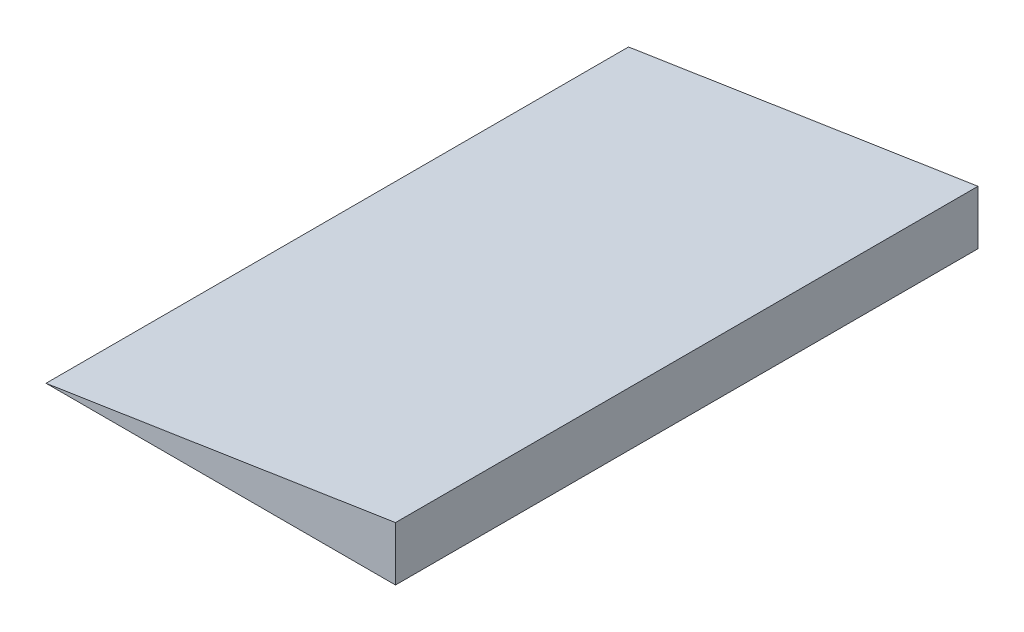
ISO-10303-21;
HEADER;
FILE_DESCRIPTION(('STEP AP214'),'2;1');
FILE_NAME('part.step','',(''),(''),'','','');
FILE_SCHEMA(('AUTOMOTIVE_DESIGN { 1 0 10303 214 1 1 1 1 }'));
ENDSEC;
DATA;
#1=APPLICATION_CONTEXT('core data for automotive mechanical design processes');
#2=APPLICATION_PROTOCOL_DEFINITION('international standard','automotive_design',2000,#1);
#3=PRODUCT_CONTEXT('',#1,'mechanical');
#4=PRODUCT('Part','Part','',(#3));
#5=PRODUCT_RELATED_PRODUCT_CATEGORY('part','',(#4));
#6=PRODUCT_DEFINITION_FORMATION('','',#4);
#7=PRODUCT_DEFINITION_CONTEXT('part definition',#1,'design');
#8=PRODUCT_DEFINITION('design','',#6,#7);
#9=PRODUCT_DEFINITION_SHAPE('','',#8);
#10=(LENGTH_UNIT() NAMED_UNIT(*) SI_UNIT(.MILLI.,.METRE.));
#11=(NAMED_UNIT(*) PLANE_ANGLE_UNIT() SI_UNIT($,.RADIAN.));
#12=(NAMED_UNIT(*) SI_UNIT($,.STERADIAN.) SOLID_ANGLE_UNIT());
#13=UNCERTAINTY_MEASURE_WITH_UNIT(LENGTH_MEASURE(1.E-05),#10,'distance_accuracy_value','');
#14=(GEOMETRIC_REPRESENTATION_CONTEXT(3) GLOBAL_UNCERTAINTY_ASSIGNED_CONTEXT((#13)) GLOBAL_UNIT_ASSIGNED_CONTEXT((#10,
#11,#12)) REPRESENTATION_CONTEXT('',''));
#15=CARTESIAN_POINT('',(0.,0.,0.));
#16=DIRECTION('',(0.,0.,1.));
#17=DIRECTION('',(1.,0.,0.));
#18=AXIS2_PLACEMENT_3D('',#15,#16,#17);
#19=CARTESIAN_POINT('',(30.,0.,50.));
#20=DIRECTION('',(0.,1.,0.));
#21=DIRECTION('',(-1.,0.,0.));
#22=AXIS2_PLACEMENT_3D('',#19,#20,#21);
#23=PLANE('',#22);
#24=DIRECTION('',(1.,0.,0.));
#25=VECTOR('',#24,1.);
#26=CARTESIAN_POINT('',(30.,0.,0.));
#27=LINE('',#26,#25);
#28=CARTESIAN_POINT('',(0.,0.,0.));
#29=VERTEX_POINT('',#28);
#30=CARTESIAN_POINT('',(30.,0.,0.));
#31=VERTEX_POINT('',#30);
#32=EDGE_CURVE('E80',#29,#31,#27,.T.);
#33=ORIENTED_EDGE('',*,*,#32,.T.);
#34=DIRECTION('',(0.,0.,-1.));
#35=VECTOR('',#34,1.);
#36=CARTESIAN_POINT('',(30.,0.,50.));
#37=LINE('',#36,#35);
#38=CARTESIAN_POINT('',(30.,0.,50.));
#39=VERTEX_POINT('',#38);
#40=EDGE_CURVE('E11',#39,#31,#37,.T.);
#41=ORIENTED_EDGE('',*,*,#40,.F.);
#42=DIRECTION('',(1.,0.,0.));
#43=VECTOR('',#42,1.);
#44=CARTESIAN_POINT('',(30.,0.,50.));
#45=LINE('',#44,#43);
#46=CARTESIAN_POINT('',(0.,0.,50.));
#47=VERTEX_POINT('',#46);
#48=EDGE_CURVE('E73',#47,#39,#45,.T.);
#49=ORIENTED_EDGE('',*,*,#48,.F.);
#50=DIRECTION('',(0.,0.,-1.));
#51=VECTOR('',#50,1.);
#52=CARTESIAN_POINT('',(0.,0.,50.));
#53=LINE('',#52,#51);
#54=EDGE_CURVE('E81',#47,#29,#53,.T.);
#55=ORIENTED_EDGE('',*,*,#54,.T.);
#56=EDGE_LOOP('',(#33,#41,#49,#55));
#57=FACE_BOUND('',#56,.T.);
#58=ADVANCED_FACE('F33',(#57),#23,.F.);
#59=CARTESIAN_POINT('',(30.,4.64424537352671,50.));
#60=DIRECTION('',(-1.,0.,0.));
#61=DIRECTION('',(0.,0.,1.));
#62=AXIS2_PLACEMENT_3D('',#59,#60,#61);
#63=PLANE('',#62);
#64=DIRECTION('',(0.,1.,0.));
#65=VECTOR('',#64,1.);
#66=CARTESIAN_POINT('',(30.,4.64424537352671,0.));
#67=LINE('',#66,#65);
#68=CARTESIAN_POINT('',(30.,4.64424537352671,0.));
#69=VERTEX_POINT('',#68);
#70=EDGE_CURVE('E61',#31,#69,#67,.T.);
#71=ORIENTED_EDGE('',*,*,#70,.T.);
#72=DIRECTION('',(0.,0.,-1.));
#73=VECTOR('',#72,1.);
#74=CARTESIAN_POINT('',(30.,4.64424537352671,50.));
#75=LINE('',#74,#73);
#76=CARTESIAN_POINT('',(30.,4.64424537352671,50.));
#77=VERTEX_POINT('',#76);
#78=EDGE_CURVE('E41',#77,#69,#75,.T.);
#79=ORIENTED_EDGE('',*,*,#78,.F.);
#80=DIRECTION('',(0.,1.,0.));
#81=VECTOR('',#80,1.);
#82=CARTESIAN_POINT('',(30.,4.64424537352671,50.));
#83=LINE('',#82,#81);
#84=EDGE_CURVE('E69',#39,#77,#83,.T.);
#85=ORIENTED_EDGE('',*,*,#84,.F.);
#86=ORIENTED_EDGE('',*,*,#40,.T.);
#87=EDGE_LOOP('',(#71,#79,#85,#86));
#88=FACE_BOUND('',#87,.T.);
#89=ADVANCED_FACE('F70',(#88),#63,.F.);
#90=CARTESIAN_POINT('',(0.,0.,50.));
#91=DIRECTION('',(0.152985836284031,-0.988228381446554,0.));
#92=DIRECTION('',(0.988228381446554,0.152985836284031,0.));
#93=AXIS2_PLACEMENT_3D('',#90,#91,#92);
#94=PLANE('',#93);
#95=DIRECTION('',(-0.988228381446554,-0.152985836284031,0.));
#96=VECTOR('',#95,1.);
#97=CARTESIAN_POINT('',(0.,0.,0.));
#98=LINE('',#97,#96);
#99=EDGE_CURVE('E66',#69,#29,#98,.T.);
#100=ORIENTED_EDGE('',*,*,#99,.T.);
#101=ORIENTED_EDGE('',*,*,#54,.F.);
#102=DIRECTION('',(-0.988228381446554,-0.152985836284031,0.));
#103=VECTOR('',#102,1.);
#104=CARTESIAN_POINT('',(0.,0.,50.));
#105=LINE('',#104,#103);
#106=EDGE_CURVE('E49',#77,#47,#105,.T.);
#107=ORIENTED_EDGE('',*,*,#106,.F.);
#108=ORIENTED_EDGE('',*,*,#78,.T.);
#109=EDGE_LOOP('',(#100,#101,#107,#108));
#110=FACE_BOUND('',#109,.T.);
#111=ADVANCED_FACE('F88',(#110),#94,.F.);
#112=CARTESIAN_POINT('',(0.,0.,50.));
#113=DIRECTION('',(0.,0.,1.));
#114=DIRECTION('',(1.,0.,0.));
#115=AXIS2_PLACEMENT_3D('',#112,#113,#114);
#116=PLANE('',#115);
#117=ORIENTED_EDGE('',*,*,#48,.T.);
#118=ORIENTED_EDGE('',*,*,#84,.T.);
#119=ORIENTED_EDGE('',*,*,#106,.T.);
#120=EDGE_LOOP('',(#117,#118,#119));
#121=FACE_BOUND('',#120,.T.);
#122=ADVANCED_FACE('F76',(#121),#116,.T.);
#123=CARTESIAN_POINT('',(0.,0.,0.));
#124=DIRECTION('',(0.,0.,1.));
#125=DIRECTION('',(1.,0.,0.));
#126=AXIS2_PLACEMENT_3D('',#123,#124,#125);
#127=PLANE('',#126);
#128=ORIENTED_EDGE('',*,*,#32,.F.);
#129=ORIENTED_EDGE('',*,*,#99,.F.);
#130=ORIENTED_EDGE('',*,*,#70,.F.);
#131=EDGE_LOOP('',(#128,#129,#130));
#132=FACE_BOUND('',#131,.T.);
#133=ADVANCED_FACE('F89',(#132),#127,.F.);
#134=CLOSED_SHELL('',(#58,#89,#111,#122,#133));
#135=MANIFOLD_SOLID_BREP('B2',#134);
#136=ADVANCED_BREP_SHAPE_REPRESENTATION('',(#18,#135),#14);
#137=SHAPE_DEFINITION_REPRESENTATION(#9,#136);
ENDSEC;
END-ISO-10303-21;
